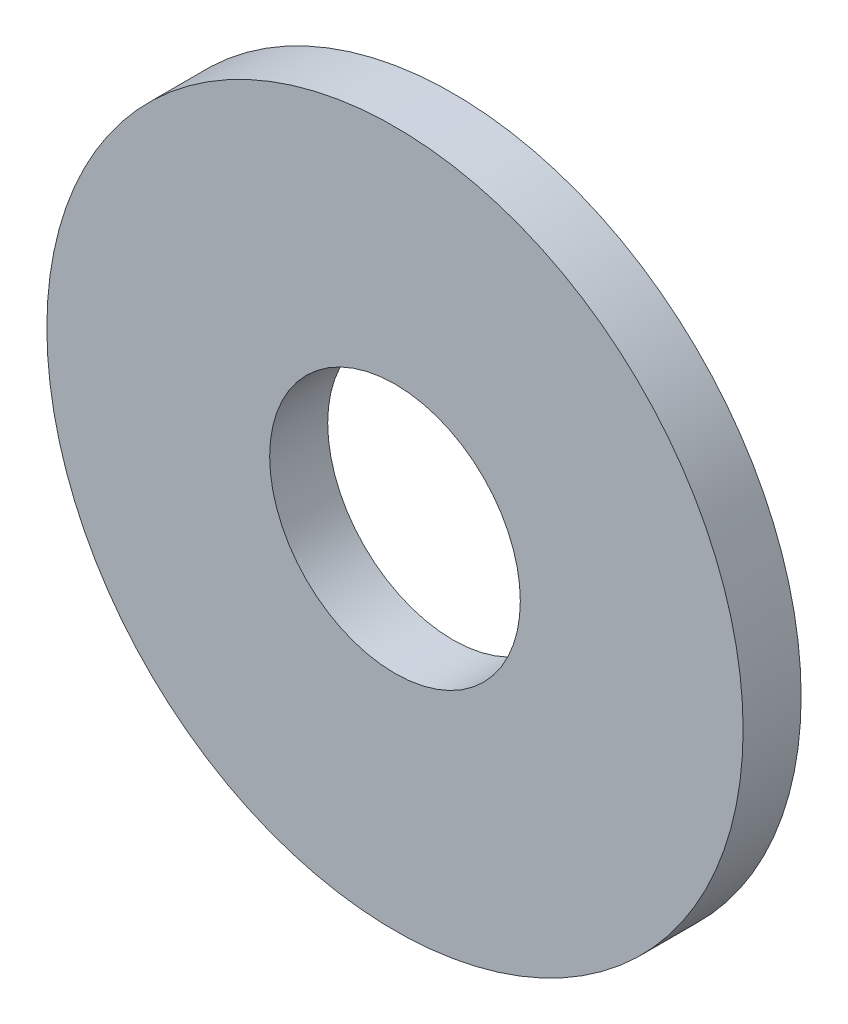
ISO-10303-21;
HEADER;
FILE_DESCRIPTION(('STEP AP214'),'2;1');
FILE_NAME('part.step','',(''),(''),'','','');
FILE_SCHEMA(('AUTOMOTIVE_DESIGN { 1 0 10303 214 1 1 1 1 }'));
ENDSEC;
DATA;
#1=APPLICATION_CONTEXT('core data for automotive mechanical design processes');
#2=APPLICATION_PROTOCOL_DEFINITION('international standard','automotive_design',2000,#1);
#3=PRODUCT_CONTEXT('',#1,'mechanical');
#4=PRODUCT('Part','Part','',(#3));
#5=PRODUCT_RELATED_PRODUCT_CATEGORY('part','',(#4));
#6=PRODUCT_DEFINITION_FORMATION('','',#4);
#7=PRODUCT_DEFINITION_CONTEXT('part definition',#1,'design');
#8=PRODUCT_DEFINITION('design','',#6,#7);
#9=PRODUCT_DEFINITION_SHAPE('','',#8);
#10=(LENGTH_UNIT() NAMED_UNIT(*) SI_UNIT(.MILLI.,.METRE.));
#11=(NAMED_UNIT(*) PLANE_ANGLE_UNIT() SI_UNIT($,.RADIAN.));
#12=(NAMED_UNIT(*) SI_UNIT($,.STERADIAN.) SOLID_ANGLE_UNIT());
#13=UNCERTAINTY_MEASURE_WITH_UNIT(LENGTH_MEASURE(1.E-05),#10,'distance_accuracy_value','');
#14=(GEOMETRIC_REPRESENTATION_CONTEXT(3) GLOBAL_UNCERTAINTY_ASSIGNED_CONTEXT((#13)) GLOBAL_UNIT_ASSIGNED_CONTEXT((#10,
#11,#12)) REPRESENTATION_CONTEXT('',''));
#15=CARTESIAN_POINT('',(0.,0.,0.));
#16=DIRECTION('',(0.,0.,1.));
#17=DIRECTION('',(1.,0.,0.));
#18=AXIS2_PLACEMENT_3D('',#15,#16,#17);
#19=CARTESIAN_POINT('',(0.,0.,1.5875));
#20=DIRECTION('',(0.,0.,1.));
#21=DIRECTION('',(1.,0.,0.));
#22=AXIS2_PLACEMENT_3D('',#19,#20,#21);
#23=PLANE('',#22);
#24=CARTESIAN_POINT('',(0.,0.,1.5875));
#25=DIRECTION('',(0.,0.,1.));
#26=DIRECTION('',(1.,0.,0.));
#27=AXIS2_PLACEMENT_3D('',#24,#25,#26);
#28=CIRCLE('',#27,9.525);
#29=CARTESIAN_POINT('',(9.525,0.,1.5875));
#30=VERTEX_POINT('',#29);
#31=EDGE_CURVE('E10',#30,#30,#28,.T.);
#32=ORIENTED_EDGE('',*,*,#31,.T.);
#33=EDGE_LOOP('',(#32));
#34=FACE_BOUND('',#33,.T.);
#35=CARTESIAN_POINT('',(0.,0.,1.5875));
#36=DIRECTION('',(0.,0.,1.));
#37=DIRECTION('',(1.,0.,0.));
#38=AXIS2_PLACEMENT_3D('',#35,#36,#37);
#39=CIRCLE('',#38,3.429);
#40=CARTESIAN_POINT('',(3.429,0.,1.5875));
#41=VERTEX_POINT('',#40);
#42=EDGE_CURVE('E42',#41,#41,#39,.T.);
#43=ORIENTED_EDGE('',*,*,#42,.F.);
#44=EDGE_LOOP('',(#43));
#45=FACE_BOUND('',#44,.T.);
#46=ADVANCED_FACE('F31',(#34,#45),#23,.T.);
#47=CARTESIAN_POINT('',(0.,0.,0.));
#48=DIRECTION('',(0.,0.,1.));
#49=DIRECTION('',(1.,0.,0.));
#50=AXIS2_PLACEMENT_3D('',#47,#48,#49);
#51=PLANE('',#50);
#52=CARTESIAN_POINT('',(0.,0.,0.));
#53=DIRECTION('',(0.,0.,1.));
#54=DIRECTION('',(1.,0.,0.));
#55=AXIS2_PLACEMENT_3D('',#52,#53,#54);
#56=CIRCLE('',#55,9.525);
#57=CARTESIAN_POINT('',(9.525,0.,0.));
#58=VERTEX_POINT('',#57);
#59=EDGE_CURVE('E35',#58,#58,#56,.T.);
#60=ORIENTED_EDGE('',*,*,#59,.F.);
#61=EDGE_LOOP('',(#60));
#62=FACE_BOUND('',#61,.T.);
#63=CARTESIAN_POINT('',(0.,0.,0.));
#64=DIRECTION('',(0.,0.,1.));
#65=DIRECTION('',(1.,0.,0.));
#66=AXIS2_PLACEMENT_3D('',#63,#64,#65);
#67=CIRCLE('',#66,3.429);
#68=CARTESIAN_POINT('',(3.429,0.,0.));
#69=VERTEX_POINT('',#68);
#70=EDGE_CURVE('E44',#69,#69,#67,.T.);
#71=ORIENTED_EDGE('',*,*,#70,.T.);
#72=EDGE_LOOP('',(#71));
#73=FACE_BOUND('',#72,.T.);
#74=ADVANCED_FACE('F54',(#62,#73),#51,.F.);
#75=CARTESIAN_POINT('',(0.,0.,1.5875));
#76=DIRECTION('',(0.,0.,-1.));
#77=DIRECTION('',(-1.,0.,0.));
#78=AXIS2_PLACEMENT_3D('',#75,#76,#77);
#79=CYLINDRICAL_SURFACE('',#78,9.525);
#80=ORIENTED_EDGE('',*,*,#31,.F.);
#81=EDGE_LOOP('',(#80));
#82=FACE_BOUND('',#81,.T.);
#83=ORIENTED_EDGE('',*,*,#59,.T.);
#84=EDGE_LOOP('',(#83));
#85=FACE_BOUND('',#84,.T.);
#86=ADVANCED_FACE('F33',(#82,#85),#79,.T.);
#87=CARTESIAN_POINT('',(0.,0.,1.5875));
#88=DIRECTION('',(0.,0.,-1.));
#89=DIRECTION('',(-1.,0.,0.));
#90=AXIS2_PLACEMENT_3D('',#87,#88,#89);
#91=CYLINDRICAL_SURFACE('',#90,3.429);
#92=ORIENTED_EDGE('',*,*,#42,.T.);
#93=EDGE_LOOP('',(#92));
#94=FACE_BOUND('',#93,.T.);
#95=ORIENTED_EDGE('',*,*,#70,.F.);
#96=EDGE_LOOP('',(#95));
#97=FACE_BOUND('',#96,.T.);
#98=ADVANCED_FACE('F50',(#94,#97),#91,.F.);
#99=CLOSED_SHELL('',(#46,#74,#86,#98));
#100=MANIFOLD_SOLID_BREP('B2',#99);
#101=ADVANCED_BREP_SHAPE_REPRESENTATION('',(#18,#100),#14);
#102=SHAPE_DEFINITION_REPRESENTATION(#9,#101);
ENDSEC;
END-ISO-10303-21;
